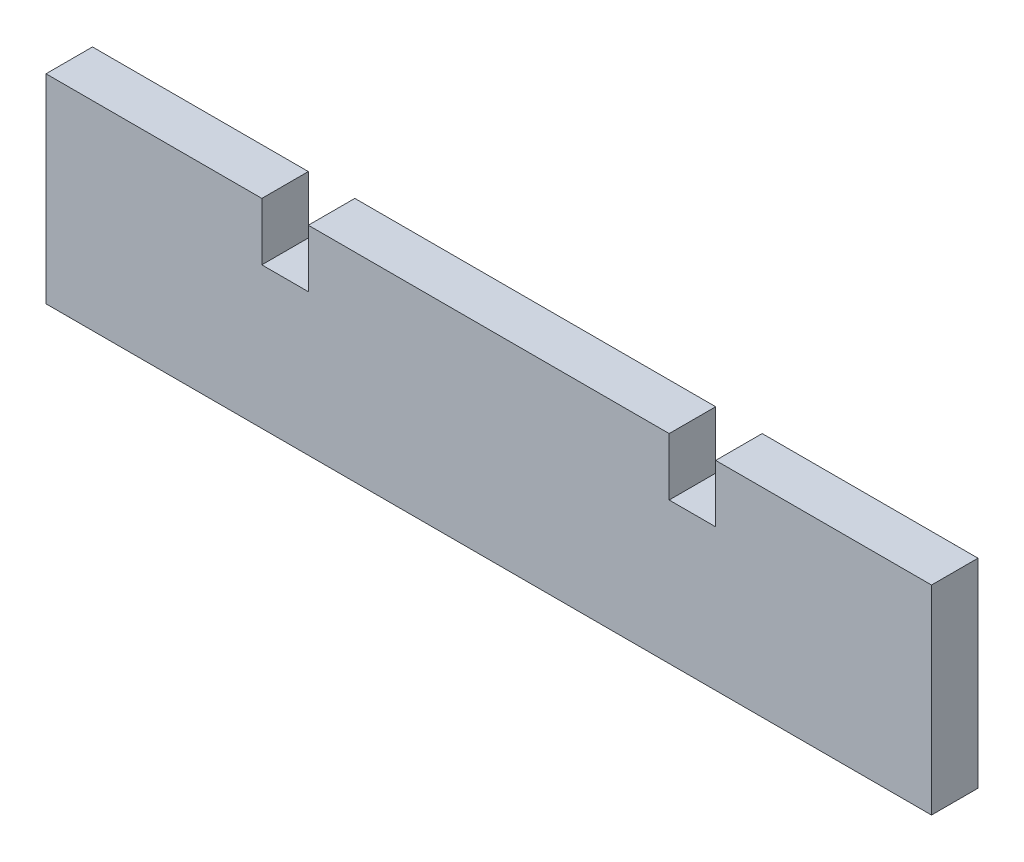
ISO-10303-21;
HEADER;
FILE_DESCRIPTION(('STEP AP214'),'2;1');
FILE_NAME('part.step','',(''),(''),'','','');
FILE_SCHEMA(('AUTOMOTIVE_DESIGN { 1 0 10303 214 1 1 1 1 }'));
ENDSEC;
DATA;
#1=APPLICATION_CONTEXT('core data for automotive mechanical design processes');
#2=APPLICATION_PROTOCOL_DEFINITION('international standard','automotive_design',2000,#1);
#3=PRODUCT_CONTEXT('',#1,'mechanical');
#4=PRODUCT('Part','Part','',(#3));
#5=PRODUCT_RELATED_PRODUCT_CATEGORY('part','',(#4));
#6=PRODUCT_DEFINITION_FORMATION('','',#4);
#7=PRODUCT_DEFINITION_CONTEXT('part definition',#1,'design');
#8=PRODUCT_DEFINITION('design','',#6,#7);
#9=PRODUCT_DEFINITION_SHAPE('','',#8);
#10=(LENGTH_UNIT() NAMED_UNIT(*) SI_UNIT(.MILLI.,.METRE.));
#11=(NAMED_UNIT(*) PLANE_ANGLE_UNIT() SI_UNIT($,.RADIAN.));
#12=(NAMED_UNIT(*) SI_UNIT($,.STERADIAN.) SOLID_ANGLE_UNIT());
#13=UNCERTAINTY_MEASURE_WITH_UNIT(LENGTH_MEASURE(1.E-05),#10,'distance_accuracy_value','');
#14=(GEOMETRIC_REPRESENTATION_CONTEXT(3) GLOBAL_UNCERTAINTY_ASSIGNED_CONTEXT((#13)) GLOBAL_UNIT_ASSIGNED_CONTEXT((#10,
#11,#12)) REPRESENTATION_CONTEXT('',''));
#15=CARTESIAN_POINT('',(0.,0.,0.));
#16=DIRECTION('',(0.,0.,1.));
#17=DIRECTION('',(1.,0.,0.));
#18=AXIS2_PLACEMENT_3D('',#15,#16,#17);
#19=CARTESIAN_POINT('',(-60.3939868121297,-18.3718129128427,5.334));
#20=DIRECTION('',(0.,-1.,0.));
#21=DIRECTION('',(0.,0.,-1.));
#22=AXIS2_PLACEMENT_3D('',#19,#20,#21);
#23=PLANE('',#22);
#24=DIRECTION('',(-1.,0.,0.));
#25=VECTOR('',#24,1.);
#26=CARTESIAN_POINT('',(-60.3939868121297,-18.3718129128427,0.));
#27=LINE('',#26,#25);
#28=CARTESIAN_POINT('',(11.1070131878703,-18.3718129128427,0.));
#29=VERTEX_POINT('',#28);
#30=CARTESIAN_POINT('',(-30.2949868121297,-18.3718129128427,0.));
#31=VERTEX_POINT('',#30);
#32=EDGE_CURVE('E145',#29,#31,#27,.T.);
#33=ORIENTED_EDGE('',*,*,#32,.T.);
#34=DIRECTION('',(0.,0.,1.));
#35=VECTOR('',#34,1.);
#36=CARTESIAN_POINT('',(-30.2949868121297,-18.3718129128427,0.));
#37=LINE('',#36,#35);
#38=CARTESIAN_POINT('',(-30.2949868121297,-18.3718129128427,5.334));
#39=VERTEX_POINT('',#38);
#40=EDGE_CURVE('E203',#31,#39,#37,.T.);
#41=ORIENTED_EDGE('',*,*,#40,.T.);
#42=DIRECTION('',(-1.,0.,0.));
#43=VECTOR('',#42,1.);
#44=CARTESIAN_POINT('',(-60.3939868121297,-18.3718129128427,5.334));
#45=LINE('',#44,#43);
#46=CARTESIAN_POINT('',(11.1070131878703,-18.3718129128427,5.334));
#47=VERTEX_POINT('',#46);
#48=EDGE_CURVE('E176',#47,#39,#45,.T.);
#49=ORIENTED_EDGE('',*,*,#48,.F.);
#50=DIRECTION('',(0.,0.,1.));
#51=VECTOR('',#50,1.);
#52=CARTESIAN_POINT('',(11.1070131878703,-18.3718129128427,0.));
#53=LINE('',#52,#51);
#54=EDGE_CURVE('E178',#29,#47,#53,.T.);
#55=ORIENTED_EDGE('',*,*,#54,.F.);
#56=EDGE_LOOP('',(#33,#41,#49,#55));
#57=FACE_BOUND('',#56,.T.);
#58=ADVANCED_FACE('F33',(#57),#23,.F.);
#59=CARTESIAN_POINT('',(-35.6289868121297,-18.3718129128427,5.334));
#60=VERTEX_POINT('',#59);
#61=CARTESIAN_POINT('',(-60.3939868121297,-18.3718129128427,5.334));
#62=VERTEX_POINT('',#61);
#63=EDGE_CURVE('E138',#60,#62,#45,.T.);
#64=ORIENTED_EDGE('',*,*,#63,.F.);
#65=DIRECTION('',(0.,0.,1.));
#66=VECTOR('',#65,1.);
#67=CARTESIAN_POINT('',(-35.6289868121297,-18.3718129128427,0.));
#68=LINE('',#67,#66);
#69=CARTESIAN_POINT('',(-35.6289868121297,-18.3718129128427,0.));
#70=VERTEX_POINT('',#69);
#71=EDGE_CURVE('E125',#70,#60,#68,.T.);
#72=ORIENTED_EDGE('',*,*,#71,.F.);
#73=CARTESIAN_POINT('',(-60.3939868121297,-18.3718129128427,0.));
#74=VERTEX_POINT('',#73);
#75=EDGE_CURVE('E136',#70,#74,#27,.T.);
#76=ORIENTED_EDGE('',*,*,#75,.T.);
#77=DIRECTION('',(0.,0.,-1.));
#78=VECTOR('',#77,1.);
#79=CARTESIAN_POINT('',(-60.3939868121297,-18.3718129128427,5.334));
#80=LINE('',#79,#78);
#81=EDGE_CURVE('E175',#62,#74,#80,.T.);
#82=ORIENTED_EDGE('',*,*,#81,.F.);
#83=EDGE_LOOP('',(#64,#72,#76,#82));
#84=FACE_BOUND('',#83,.T.);
#85=ADVANCED_FACE('F134',(#84),#23,.F.);
#86=CARTESIAN_POINT('',(-60.3939868121297,-18.3718129128427,5.334));
#87=DIRECTION('',(1.,0.,0.));
#88=DIRECTION('',(0.,0.,-1.));
#89=AXIS2_PLACEMENT_3D('',#86,#87,#88);
#90=PLANE('',#89);
#91=DIRECTION('',(0.,-1.,0.));
#92=VECTOR('',#91,1.);
#93=CARTESIAN_POINT('',(-60.3939868121297,-18.3718129128427,0.));
#94=LINE('',#93,#92);
#95=CARTESIAN_POINT('',(-60.3939868121297,-41.2318129128427,0.));
#96=VERTEX_POINT('',#95);
#97=EDGE_CURVE('E144',#74,#96,#94,.T.);
#98=ORIENTED_EDGE('',*,*,#97,.T.);
#99=DIRECTION('',(0.,0.,-1.));
#100=VECTOR('',#99,1.);
#101=CARTESIAN_POINT('',(-60.3939868121297,-41.2318129128427,5.334));
#102=LINE('',#101,#100);
#103=CARTESIAN_POINT('',(-60.3939868121297,-41.2318129128427,5.334));
#104=VERTEX_POINT('',#103);
#105=EDGE_CURVE('E11',#104,#96,#102,.T.);
#106=ORIENTED_EDGE('',*,*,#105,.F.);
#107=DIRECTION('',(0.,-1.,0.));
#108=VECTOR('',#107,1.);
#109=CARTESIAN_POINT('',(-60.3939868121297,-18.3718129128427,5.334));
#110=LINE('',#109,#108);
#111=EDGE_CURVE('E154',#62,#104,#110,.T.);
#112=ORIENTED_EDGE('',*,*,#111,.F.);
#113=ORIENTED_EDGE('',*,*,#81,.T.);
#114=EDGE_LOOP('',(#98,#106,#112,#113));
#115=FACE_BOUND('',#114,.T.);
#116=ADVANCED_FACE('F35',(#115),#90,.F.);
#117=CARTESIAN_POINT('',(-60.3939868121297,-41.2318129128427,5.334));
#118=DIRECTION('',(0.,1.,0.));
#119=DIRECTION('',(0.,0.,1.));
#120=AXIS2_PLACEMENT_3D('',#117,#118,#119);
#121=PLANE('',#120);
#122=DIRECTION('',(1.,0.,0.));
#123=VECTOR('',#122,1.);
#124=CARTESIAN_POINT('',(-60.3939868121297,-41.2318129128427,0.));
#125=LINE('',#124,#123);
#126=CARTESIAN_POINT('',(41.2060131878703,-41.2318129128427,0.));
#127=VERTEX_POINT('',#126);
#128=EDGE_CURVE('E150',#96,#127,#125,.T.);
#129=ORIENTED_EDGE('',*,*,#128,.T.);
#130=DIRECTION('',(0.,0.,-1.));
#131=VECTOR('',#130,1.);
#132=CARTESIAN_POINT('',(41.2060131878703,-41.2318129128427,5.334));
#133=LINE('',#132,#131);
#134=CARTESIAN_POINT('',(41.2060131878703,-41.2318129128427,5.334));
#135=VERTEX_POINT('',#134);
#136=EDGE_CURVE('E41',#135,#127,#133,.T.);
#137=ORIENTED_EDGE('',*,*,#136,.F.);
#138=DIRECTION('',(1.,0.,0.));
#139=VECTOR('',#138,1.);
#140=CARTESIAN_POINT('',(-60.3939868121297,-41.2318129128427,5.334));
#141=LINE('',#140,#139);
#142=EDGE_CURVE('E160',#104,#135,#141,.T.);
#143=ORIENTED_EDGE('',*,*,#142,.F.);
#144=ORIENTED_EDGE('',*,*,#105,.T.);
#145=EDGE_LOOP('',(#129,#137,#143,#144));
#146=FACE_BOUND('',#145,.T.);
#147=ADVANCED_FACE('F182',(#146),#121,.F.);
#148=CARTESIAN_POINT('',(41.2060131878703,-18.3718129128427,5.334));
#149=DIRECTION('',(-1.,0.,0.));
#150=DIRECTION('',(0.,0.,1.));
#151=AXIS2_PLACEMENT_3D('',#148,#149,#150);
#152=PLANE('',#151);
#153=DIRECTION('',(0.,1.,0.));
#154=VECTOR('',#153,1.);
#155=CARTESIAN_POINT('',(41.2060131878703,-18.3718129128427,0.));
#156=LINE('',#155,#154);
#157=CARTESIAN_POINT('',(41.2060131878703,-18.3718129128427,0.));
#158=VERTEX_POINT('',#157);
#159=EDGE_CURVE('E146',#127,#158,#156,.T.);
#160=ORIENTED_EDGE('',*,*,#159,.T.);
#161=DIRECTION('',(0.,0.,-1.));
#162=VECTOR('',#161,1.);
#163=CARTESIAN_POINT('',(41.2060131878703,-18.3718129128427,5.334));
#164=LINE('',#163,#162);
#165=CARTESIAN_POINT('',(41.2060131878703,-18.3718129128427,5.334));
#166=VERTEX_POINT('',#165);
#167=EDGE_CURVE('E188',#166,#158,#164,.T.);
#168=ORIENTED_EDGE('',*,*,#167,.F.);
#169=DIRECTION('',(0.,1.,0.));
#170=VECTOR('',#169,1.);
#171=CARTESIAN_POINT('',(41.2060131878703,-18.3718129128427,5.334));
#172=LINE('',#171,#170);
#173=EDGE_CURVE('E165',#135,#166,#172,.T.);
#174=ORIENTED_EDGE('',*,*,#173,.F.);
#175=ORIENTED_EDGE('',*,*,#136,.T.);
#176=EDGE_LOOP('',(#160,#168,#174,#175));
#177=FACE_BOUND('',#176,.T.);
#178=ADVANCED_FACE('F186',(#177),#152,.F.);
#179=CARTESIAN_POINT('',(16.4410131878703,-18.3718129128427,0.));
#180=VERTEX_POINT('',#179);
#181=EDGE_CURVE('E148',#158,#180,#27,.T.);
#182=ORIENTED_EDGE('',*,*,#181,.T.);
#183=DIRECTION('',(0.,0.,1.));
#184=VECTOR('',#183,1.);
#185=CARTESIAN_POINT('',(16.4410131878703,-18.3718129128427,0.));
#186=LINE('',#185,#184);
#187=CARTESIAN_POINT('',(16.4410131878703,-18.3718129128427,5.334));
#188=VERTEX_POINT('',#187);
#189=EDGE_CURVE('E209',#180,#188,#186,.T.);
#190=ORIENTED_EDGE('',*,*,#189,.T.);
#191=EDGE_CURVE('E172',#166,#188,#45,.T.);
#192=ORIENTED_EDGE('',*,*,#191,.F.);
#193=ORIENTED_EDGE('',*,*,#167,.T.);
#194=EDGE_LOOP('',(#182,#190,#192,#193));
#195=FACE_BOUND('',#194,.T.);
#196=ADVANCED_FACE('F219',(#195),#23,.F.);
#197=CARTESIAN_POINT('',(0.,0.,5.334));
#198=DIRECTION('',(0.,0.,1.));
#199=DIRECTION('',(1.,0.,0.));
#200=AXIS2_PLACEMENT_3D('',#197,#198,#199);
#201=PLANE('',#200);
#202=DIRECTION('',(0.,1.,0.));
#203=VECTOR('',#202,1.);
#204=CARTESIAN_POINT('',(-30.2949868121297,-18.3718129128427,5.334));
#205=LINE('',#204,#203);
#206=CARTESIAN_POINT('',(-30.2949868121297,-24.9758129128427,5.334));
#207=VERTEX_POINT('',#206);
#208=EDGE_CURVE('E130',#207,#39,#205,.T.);
#209=ORIENTED_EDGE('',*,*,#208,.F.);
#210=DIRECTION('',(1.,0.,0.));
#211=VECTOR('',#210,1.);
#212=CARTESIAN_POINT('',(-30.2949868121297,-24.9758129128427,5.334));
#213=LINE('',#212,#211);
#214=CARTESIAN_POINT('',(-35.6289868121297,-24.9758129128427,5.334));
#215=VERTEX_POINT('',#214);
#216=EDGE_CURVE('E337',#215,#207,#213,.T.);
#217=ORIENTED_EDGE('',*,*,#216,.F.);
#218=DIRECTION('',(0.,-1.,0.));
#219=VECTOR('',#218,1.);
#220=CARTESIAN_POINT('',(-35.6289868121297,-18.3718129128427,5.334));
#221=LINE('',#220,#219);
#222=EDGE_CURVE('E340',#60,#215,#221,.T.);
#223=ORIENTED_EDGE('',*,*,#222,.F.);
#224=ORIENTED_EDGE('',*,*,#63,.T.);
#225=ORIENTED_EDGE('',*,*,#111,.T.);
#226=ORIENTED_EDGE('',*,*,#142,.T.);
#227=ORIENTED_EDGE('',*,*,#173,.T.);
#228=ORIENTED_EDGE('',*,*,#191,.T.);
#229=DIRECTION('',(0.,1.,0.));
#230=VECTOR('',#229,1.);
#231=CARTESIAN_POINT('',(16.4410131878703,-18.3718129128427,5.334));
#232=LINE('',#231,#230);
#233=CARTESIAN_POINT('',(16.4410131878703,-24.9758129128427,5.334));
#234=VERTEX_POINT('',#233);
#235=EDGE_CURVE('E206',#234,#188,#232,.T.);
#236=ORIENTED_EDGE('',*,*,#235,.F.);
#237=DIRECTION('',(1.,0.,0.));
#238=VECTOR('',#237,1.);
#239=CARTESIAN_POINT('',(11.1070131878703,-24.9758129128427,5.334));
#240=LINE('',#239,#238);
#241=CARTESIAN_POINT('',(11.1070131878703,-24.9758129128427,5.334));
#242=VERTEX_POINT('',#241);
#243=EDGE_CURVE('E202',#242,#234,#240,.T.);
#244=ORIENTED_EDGE('',*,*,#243,.F.);
#245=DIRECTION('',(0.,-1.,0.));
#246=VECTOR('',#245,1.);
#247=CARTESIAN_POINT('',(11.1070131878703,-18.3718129128427,5.334));
#248=LINE('',#247,#246);
#249=EDGE_CURVE('E199',#47,#242,#248,.T.);
#250=ORIENTED_EDGE('',*,*,#249,.F.);
#251=ORIENTED_EDGE('',*,*,#48,.T.);
#252=EDGE_LOOP('',(#209,#217,#223,#224,#225,#226,#227,#228,#236,#244,#250,#251));
#253=FACE_BOUND('',#252,.T.);
#254=ADVANCED_FACE('F217',(#253),#201,.T.);
#255=CARTESIAN_POINT('',(0.,0.,0.));
#256=DIRECTION('',(0.,0.,1.));
#257=DIRECTION('',(1.,0.,0.));
#258=AXIS2_PLACEMENT_3D('',#255,#256,#257);
#259=PLANE('',#258);
#260=DIRECTION('',(1.,0.,0.));
#261=VECTOR('',#260,1.);
#262=CARTESIAN_POINT('',(-30.2949868121297,-24.9758129128427,0.));
#263=LINE('',#262,#261);
#264=CARTESIAN_POINT('',(-35.6289868121297,-24.9758129128427,0.));
#265=VERTEX_POINT('',#264);
#266=CARTESIAN_POINT('',(-30.2949868121297,-24.9758129128427,0.));
#267=VERTEX_POINT('',#266);
#268=EDGE_CURVE('E48',#265,#267,#263,.T.);
#269=ORIENTED_EDGE('',*,*,#268,.T.);
#270=DIRECTION('',(0.,1.,0.));
#271=VECTOR('',#270,1.);
#272=CARTESIAN_POINT('',(-30.2949868121297,-18.3718129128427,0.));
#273=LINE('',#272,#271);
#274=EDGE_CURVE('E139',#267,#31,#273,.T.);
#275=ORIENTED_EDGE('',*,*,#274,.T.);
#276=ORIENTED_EDGE('',*,*,#32,.F.);
#277=DIRECTION('',(0.,-1.,0.));
#278=VECTOR('',#277,1.);
#279=CARTESIAN_POINT('',(11.1070131878703,-18.3718129128427,0.));
#280=LINE('',#279,#278);
#281=CARTESIAN_POINT('',(11.1070131878703,-24.9758129128427,0.));
#282=VERTEX_POINT('',#281);
#283=EDGE_CURVE('E195',#29,#282,#280,.T.);
#284=ORIENTED_EDGE('',*,*,#283,.T.);
#285=DIRECTION('',(1.,0.,0.));
#286=VECTOR('',#285,1.);
#287=CARTESIAN_POINT('',(11.1070131878703,-24.9758129128427,0.));
#288=LINE('',#287,#286);
#289=CARTESIAN_POINT('',(16.4410131878703,-24.9758129128427,0.));
#290=VERTEX_POINT('',#289);
#291=EDGE_CURVE('E192',#282,#290,#288,.T.);
#292=ORIENTED_EDGE('',*,*,#291,.T.);
#293=DIRECTION('',(0.,1.,0.));
#294=VECTOR('',#293,1.);
#295=CARTESIAN_POINT('',(16.4410131878703,-18.3718129128427,0.));
#296=LINE('',#295,#294);
#297=EDGE_CURVE('E56',#290,#180,#296,.T.);
#298=ORIENTED_EDGE('',*,*,#297,.T.);
#299=ORIENTED_EDGE('',*,*,#181,.F.);
#300=ORIENTED_EDGE('',*,*,#159,.F.);
#301=ORIENTED_EDGE('',*,*,#128,.F.);
#302=ORIENTED_EDGE('',*,*,#97,.F.);
#303=ORIENTED_EDGE('',*,*,#75,.F.);
#304=DIRECTION('',(0.,-1.,0.));
#305=VECTOR('',#304,1.);
#306=CARTESIAN_POINT('',(-35.6289868121297,-18.3718129128427,0.));
#307=LINE('',#306,#305);
#308=EDGE_CURVE('E121',#70,#265,#307,.T.);
#309=ORIENTED_EDGE('',*,*,#308,.T.);
#310=EDGE_LOOP('',(#269,#275,#276,#284,#292,#298,#299,#300,#301,#302,#303,#309));
#311=FACE_BOUND('',#310,.T.);
#312=ADVANCED_FACE('F142',(#311),#259,.F.);
#313=CARTESIAN_POINT('',(11.1070131878703,-18.3718129128427,0.));
#314=DIRECTION('',(-1.,0.,0.));
#315=DIRECTION('',(0.,-1.,0.));
#316=AXIS2_PLACEMENT_3D('',#313,#314,#315);
#317=PLANE('',#316);
#318=ORIENTED_EDGE('',*,*,#249,.T.);
#319=DIRECTION('',(0.,0.,1.));
#320=VECTOR('',#319,1.);
#321=CARTESIAN_POINT('',(11.1070131878703,-24.9758129128427,0.));
#322=LINE('',#321,#320);
#323=EDGE_CURVE('E168',#282,#242,#322,.T.);
#324=ORIENTED_EDGE('',*,*,#323,.F.);
#325=ORIENTED_EDGE('',*,*,#283,.F.);
#326=ORIENTED_EDGE('',*,*,#54,.T.);
#327=EDGE_LOOP('',(#318,#324,#325,#326));
#328=FACE_BOUND('',#327,.T.);
#329=ADVANCED_FACE('F272',(#328),#317,.F.);
#330=CARTESIAN_POINT('',(16.4410131878703,-18.3718129128427,0.));
#331=DIRECTION('',(1.,0.,0.));
#332=DIRECTION('',(0.,0.,-1.));
#333=AXIS2_PLACEMENT_3D('',#330,#331,#332);
#334=PLANE('',#333);
#335=ORIENTED_EDGE('',*,*,#235,.T.);
#336=ORIENTED_EDGE('',*,*,#189,.F.);
#337=ORIENTED_EDGE('',*,*,#297,.F.);
#338=DIRECTION('',(0.,0.,1.));
#339=VECTOR('',#338,1.);
#340=CARTESIAN_POINT('',(16.4410131878703,-24.9758129128427,0.));
#341=LINE('',#340,#339);
#342=EDGE_CURVE('E194',#290,#234,#341,.T.);
#343=ORIENTED_EDGE('',*,*,#342,.T.);
#344=EDGE_LOOP('',(#335,#336,#337,#343));
#345=FACE_BOUND('',#344,.T.);
#346=ADVANCED_FACE('F210',(#345),#334,.F.);
#347=CARTESIAN_POINT('',(11.1070131878703,-24.9758129128427,0.));
#348=DIRECTION('',(0.,-1.,0.));
#349=DIRECTION('',(0.,0.,-1.));
#350=AXIS2_PLACEMENT_3D('',#347,#348,#349);
#351=PLANE('',#350);
#352=ORIENTED_EDGE('',*,*,#243,.T.);
#353=ORIENTED_EDGE('',*,*,#342,.F.);
#354=ORIENTED_EDGE('',*,*,#291,.F.);
#355=ORIENTED_EDGE('',*,*,#323,.T.);
#356=EDGE_LOOP('',(#352,#353,#354,#355));
#357=FACE_BOUND('',#356,.T.);
#358=ADVANCED_FACE('F214',(#357),#351,.F.);
#359=CARTESIAN_POINT('',(-30.2949868121297,-18.3718129128427,0.));
#360=DIRECTION('',(1.,0.,0.));
#361=DIRECTION('',(0.,1.,0.));
#362=AXIS2_PLACEMENT_3D('',#359,#360,#361);
#363=PLANE('',#362);
#364=ORIENTED_EDGE('',*,*,#208,.T.);
#365=ORIENTED_EDGE('',*,*,#40,.F.);
#366=ORIENTED_EDGE('',*,*,#274,.F.);
#367=DIRECTION('',(0.,0.,1.));
#368=VECTOR('',#367,1.);
#369=CARTESIAN_POINT('',(-30.2949868121297,-24.9758129128427,0.));
#370=LINE('',#369,#368);
#371=EDGE_CURVE('E338',#267,#207,#370,.T.);
#372=ORIENTED_EDGE('',*,*,#371,.T.);
#373=EDGE_LOOP('',(#364,#365,#366,#372));
#374=FACE_BOUND('',#373,.T.);
#375=ADVANCED_FACE('F302',(#374),#363,.F.);
#376=CARTESIAN_POINT('',(-30.2949868121297,-24.9758129128427,0.));
#377=DIRECTION('',(0.,-1.,0.));
#378=DIRECTION('',(1.,0.,0.));
#379=AXIS2_PLACEMENT_3D('',#376,#377,#378);
#380=PLANE('',#379);
#381=ORIENTED_EDGE('',*,*,#216,.T.);
#382=ORIENTED_EDGE('',*,*,#371,.F.);
#383=ORIENTED_EDGE('',*,*,#268,.F.);
#384=DIRECTION('',(0.,0.,1.));
#385=VECTOR('',#384,1.);
#386=CARTESIAN_POINT('',(-35.6289868121297,-24.9758129128427,0.));
#387=LINE('',#386,#385);
#388=EDGE_CURVE('E127',#265,#215,#387,.T.);
#389=ORIENTED_EDGE('',*,*,#388,.T.);
#390=EDGE_LOOP('',(#381,#382,#383,#389));
#391=FACE_BOUND('',#390,.T.);
#392=ADVANCED_FACE('F310',(#391),#380,.F.);
#393=CARTESIAN_POINT('',(-35.6289868121297,-18.3718129128427,0.));
#394=DIRECTION('',(-1.,0.,0.));
#395=DIRECTION('',(0.,-1.,0.));
#396=AXIS2_PLACEMENT_3D('',#393,#394,#395);
#397=PLANE('',#396);
#398=ORIENTED_EDGE('',*,*,#222,.T.);
#399=ORIENTED_EDGE('',*,*,#388,.F.);
#400=ORIENTED_EDGE('',*,*,#308,.F.);
#401=ORIENTED_EDGE('',*,*,#71,.T.);
#402=EDGE_LOOP('',(#398,#399,#400,#401));
#403=FACE_BOUND('',#402,.T.);
#404=ADVANCED_FACE('F124',(#403),#397,.F.);
#405=CLOSED_SHELL('',(#58,#85,#116,#147,#178,#196,#254,#312,#329,#346,#358,#375,#392,#404));
#406=MANIFOLD_SOLID_BREP('B2',#405);
#407=ADVANCED_BREP_SHAPE_REPRESENTATION('',(#18,#406),#14);
#408=SHAPE_DEFINITION_REPRESENTATION(#9,#407);
ENDSEC;
END-ISO-10303-21;
